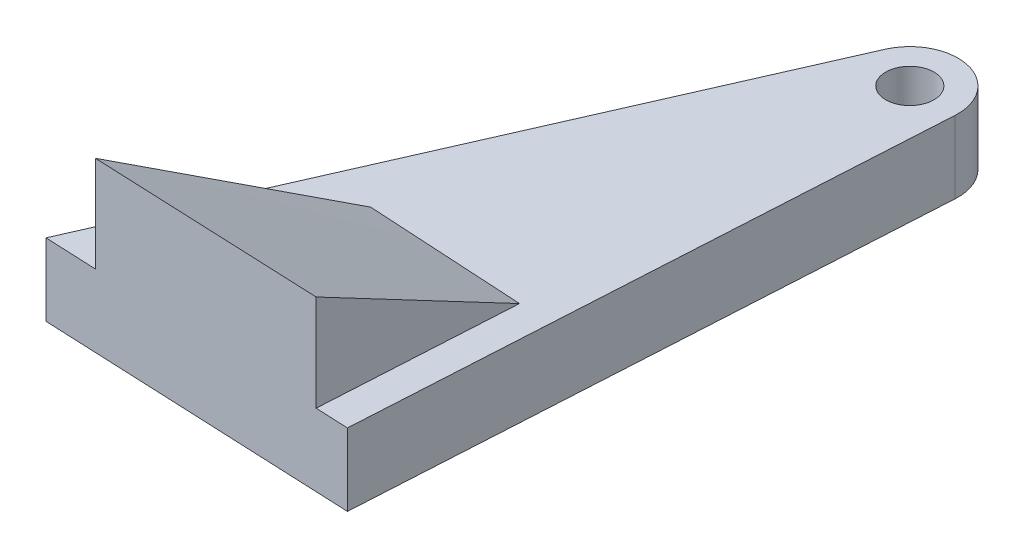
ISO-10303-21;
HEADER;
FILE_DESCRIPTION(('STEP AP214'),'2;1');
FILE_NAME('part.step','',(''),(''),'','','');
FILE_SCHEMA(('AUTOMOTIVE_DESIGN { 1 0 10303 214 1 1 1 1 }'));
ENDSEC;
DATA;
#1=APPLICATION_CONTEXT('core data for automotive mechanical design processes');
#2=APPLICATION_PROTOCOL_DEFINITION('international standard','automotive_design',2000,#1);
#3=PRODUCT_CONTEXT('',#1,'mechanical');
#4=PRODUCT('Part','Part','',(#3));
#5=PRODUCT_RELATED_PRODUCT_CATEGORY('part','',(#4));
#6=PRODUCT_DEFINITION_FORMATION('','',#4);
#7=PRODUCT_DEFINITION_CONTEXT('part definition',#1,'design');
#8=PRODUCT_DEFINITION('design','',#6,#7);
#9=PRODUCT_DEFINITION_SHAPE('','',#8);
#10=(LENGTH_UNIT() NAMED_UNIT(*) SI_UNIT(.MILLI.,.METRE.));
#11=(NAMED_UNIT(*) PLANE_ANGLE_UNIT() SI_UNIT($,.RADIAN.));
#12=(NAMED_UNIT(*) SI_UNIT($,.STERADIAN.) SOLID_ANGLE_UNIT());
#13=UNCERTAINTY_MEASURE_WITH_UNIT(LENGTH_MEASURE(1.E-05),#10,'distance_accuracy_value','');
#14=(GEOMETRIC_REPRESENTATION_CONTEXT(3) GLOBAL_UNCERTAINTY_ASSIGNED_CONTEXT((#13)) GLOBAL_UNIT_ASSIGNED_CONTEXT((#10,
#11,#12)) REPRESENTATION_CONTEXT('',''));
#15=CARTESIAN_POINT('',(0.,0.,0.));
#16=DIRECTION('',(0.,0.,1.));
#17=DIRECTION('',(1.,0.,0.));
#18=AXIS2_PLACEMENT_3D('',#15,#16,#17);
#19=CARTESIAN_POINT('',(0.0971822443924432,0.,-2.20336771731144));
#20=DIRECTION('',(0.0440633917430162,0.,-0.999028737078219));
#21=DIRECTION('',(-0.999028737078219,0.,-0.0440633917430162));
#22=AXIS2_PLACEMENT_3D('',#19,#20,#21);
#23=PLANE('',#22);
#24=DIRECTION('',(0.,1.,0.));
#25=VECTOR('',#24,1.);
#26=CARTESIAN_POINT('',(-155.912359032913,299.750000000374,-9.08436050341978));
#27=LINE('',#26,#25);
#28=CARTESIAN_POINT('',(-155.91235901784,296.750000000374,-9.08436050275499));
#29=VERTEX_POINT('',#28);
#30=CARTESIAN_POINT('',(-155.912359032913,299.750000000374,-9.08436050341978));
#31=VERTEX_POINT('',#30);
#32=EDGE_CURVE('E112',#29,#31,#27,.T.);
#33=ORIENTED_EDGE('',*,*,#32,.T.);
#34=DIRECTION('',(-0.999028737078219,0.,-0.0440633917430162));
#35=VECTOR('',#34,1.);
#36=CARTESIAN_POINT('',(-157.587224197499,299.750000000374,-9.15823249240755));
#37=LINE('',#36,#35);
#38=CARTESIAN_POINT('',(-157.271162701324,299.750000000374,-9.14429221120845));
#39=VERTEX_POINT('',#38);
#40=EDGE_CURVE('E121',#31,#39,#37,.T.);
#41=ORIENTED_EDGE('',*,*,#40,.T.);
#42=DIRECTION('',(0.,-1.,0.));
#43=VECTOR('',#42,1.);
#44=CARTESIAN_POINT('',(-157.271162701324,303.750000000374,-9.14429221120845));
#45=LINE('',#44,#43);
#46=CARTESIAN_POINT('',(-157.271162701324,303.745464129985,-9.14429221120845));
#47=VERTEX_POINT('',#46);
#48=EDGE_CURVE('E165',#47,#39,#45,.T.);
#49=ORIENTED_EDGE('',*,*,#48,.F.);
#50=CARTESIAN_POINT('',(-166.850256823997,303.728007448144,-9.56678994446184));
#51=CARTESIAN_POINT('',(-166.052048846484,303.729441749034,-9.53158399942728));
#52=CARTESIAN_POINT('',(-165.253840877963,303.730881067688,-9.49637805478929));
#53=CARTESIAN_POINT('',(-163.258221174065,303.734492210886,-9.40835879216016));
#54=CARTESIAN_POINT('',(-162.060809450125,303.736670370312,-9.35554547467346));
#55=CARTESIAN_POINT('',(-159.66598604402,303.741049819973,-9.24991884154258));
#56=CARTESIAN_POINT('',(-158.468574361855,303.743251110208,-9.1971055258984));
#57=CARTESIAN_POINT('',(-157.271162701324,303.745464129985,-9.14429221120845));
#58=B_SPLINE_CURVE_WITH_KNOTS('',3,(#50,#51,#52,#53,#54,#55,#56,#57),.UNSPECIFIED.,.F.,.F.,(4,2,
2,4),(0.,2.39695586533243,5.99268937130397,9.58842287860833),.UNSPECIFIED.);
#59=CARTESIAN_POINT('',(-166.850256823997,303.728007448144,-9.56678994446184));
#60=VERTEX_POINT('',#59);
#61=EDGE_CURVE('E155',#60,#47,#58,.T.);
#62=ORIENTED_EDGE('',*,*,#61,.F.);
#63=DIRECTION('',(0.,1.,0.));
#64=VECTOR('',#63,1.);
#65=CARTESIAN_POINT('',(-166.850256823997,303.750000000374,-9.56678994446184));
#66=LINE('',#65,#64);
#67=CARTESIAN_POINT('',(-166.850256823997,299.750000000374,-9.56678994446185));
#68=VERTEX_POINT('',#67);
#69=EDGE_CURVE('E117',#68,#60,#66,.T.);
#70=ORIENTED_EDGE('',*,*,#69,.F.);
#71=CARTESIAN_POINT('',(-168.993386885902,299.750000000374,-9.66131533294081));
#72=VERTEX_POINT('',#71);
#73=EDGE_CURVE('E114',#68,#72,#37,.T.);
#74=ORIENTED_EDGE('',*,*,#73,.T.);
#75=DIRECTION('',(0.,-1.,0.));
#76=VECTOR('',#75,1.);
#77=CARTESIAN_POINT('',(-168.993386885902,299.750000000374,-9.66131533294081));
#78=LINE('',#77,#76);
#79=CARTESIAN_POINT('',(-168.993386885902,296.750000000374,-9.66131533294081));
#80=VERTEX_POINT('',#79);
#81=EDGE_CURVE('E46',#72,#80,#78,.T.);
#82=ORIENTED_EDGE('',*,*,#81,.T.);
#83=DIRECTION('',(-0.999028737078219,0.,-0.0440633917430162));
#84=VECTOR('',#83,1.);
#85=CARTESIAN_POINT('',(-155.527975618642,296.750000000374,-9.06740679995367));
#86=LINE('',#85,#84);
#87=EDGE_CURVE('E161',#29,#80,#86,.T.);
#88=ORIENTED_EDGE('',*,*,#87,.F.);
#89=EDGE_LOOP('',(#33,#41,#49,#62,#70,#74,#82,#88));
#90=FACE_BOUND('',#89,.T.);
#91=ADVANCED_FACE('F42',(#90),#23,.F.);
#92=CARTESIAN_POINT('',(-156.534035996753,299.750000000374,-33.0366775343517));
#93=DIRECTION('',(0.,-1.,0.));
#94=DIRECTION('',(0.,0.,-1.));
#95=AXIS2_PLACEMENT_3D('',#92,#93,#94);
#96=CYLINDRICAL_SURFACE('',#95,0.999999999999998);
#97=CARTESIAN_POINT('',(-156.534035996753,299.750000000374,-33.0366775343517));
#98=DIRECTION('',(0.,-1.,0.));
#99=DIRECTION('',(0.,0.,-1.));
#100=AXIS2_PLACEMENT_3D('',#97,#98,#99);
#101=CIRCLE('',#100,0.999999999999998);
#102=CARTESIAN_POINT('',(-156.534035996753,299.750000000374,-34.0366775343517));
#103=VERTEX_POINT('',#102);
#104=EDGE_CURVE('E142',#103,#103,#101,.T.);
#105=ORIENTED_EDGE('',*,*,#104,.F.);
#106=EDGE_LOOP('',(#105));
#107=FACE_BOUND('',#106,.T.);
#108=CARTESIAN_POINT('',(-156.534035996753,296.750000000374,-33.0366775343517));
#109=DIRECTION('',(0.,-1.,0.));
#110=DIRECTION('',(0.,0.,-1.));
#111=AXIS2_PLACEMENT_3D('',#108,#109,#110);
#112=CIRCLE('',#111,0.999999999999998);
#113=CARTESIAN_POINT('',(-156.534035996753,296.750000000374,-34.0366775343517));
#114=VERTEX_POINT('',#113);
#115=EDGE_CURVE('E153',#114,#114,#112,.T.);
#116=ORIENTED_EDGE('',*,*,#115,.T.);
#117=EDGE_LOOP('',(#116));
#118=FACE_BOUND('',#117,.T.);
#119=ADVANCED_FACE('F207',(#107,#118),#96,.F.);
#120=CARTESIAN_POINT('',(-156.534035996753,299.750000000374,-33.0366775343517));
#121=DIRECTION('',(0.,1.,0.));
#122=DIRECTION('',(0.,0.,1.));
#123=AXIS2_PLACEMENT_3D('',#120,#121,#122);
#124=PLANE('',#123);
#125=ORIENTED_EDGE('',*,*,#40,.F.);
#126=DIRECTION('',(-0.0575875282287934,0.,0.998340461261837));
#127=VECTOR('',#126,1.);
#128=CARTESIAN_POINT('',(-154.537355074229,299.750000000374,-32.9215024778942));
#129=LINE('',#128,#127);
#130=CARTESIAN_POINT('',(-154.537355074229,299.750000000374,-32.9215024778942));
#131=VERTEX_POINT('',#130);
#132=EDGE_CURVE('E130',#131,#31,#129,.T.);
#133=ORIENTED_EDGE('',*,*,#132,.F.);
#134=CARTESIAN_POINT('',(-156.534035996753,299.750000000374,-33.0366775343517));
#135=DIRECTION('',(0.,-1.,0.));
#136=DIRECTION('',(0.,0.,1.));
#137=AXIS2_PLACEMENT_3D('',#134,#135,#136);
#138=CIRCLE('',#137,2.00000000000002);
#139=CARTESIAN_POINT('',(-158.364968743311,299.750000000374,-33.8414664989764));
#140=VERTEX_POINT('',#139);
#141=EDGE_CURVE('E128',#140,#131,#138,.T.);
#142=ORIENTED_EDGE('',*,*,#141,.F.);
#143=DIRECTION('',(0.402394482312312,0.,-0.915466373279));
#144=VECTOR('',#143,1.);
#145=CARTESIAN_POINT('',(-158.364968743311,299.750000000374,-33.8414664989764));
#146=LINE('',#145,#144);
#147=EDGE_CURVE('E108',#72,#140,#146,.T.);
#148=ORIENTED_EDGE('',*,*,#147,.F.);
#149=ORIENTED_EDGE('',*,*,#73,.F.);
#150=DIRECTION('',(-0.402394482312311,0.,0.915466373279001));
#151=VECTOR('',#150,1.);
#152=CARTESIAN_POINT('',(-163.363241115742,299.750000000374,-17.4999146872732));
#153=LINE('',#152,#151);
#154=CARTESIAN_POINT('',(-163.363241115742,299.750000000374,-17.4999146872732));
#155=VERTEX_POINT('',#154);
#156=EDGE_CURVE('E189',#155,#68,#153,.T.);
#157=ORIENTED_EDGE('',*,*,#156,.F.);
#158=DIRECTION('',(-0.998340461261837,0.,-0.0575875282287913));
#159=VECTOR('',#158,1.);
#160=CARTESIAN_POINT('',(-156.810984894622,299.750000000374,-17.1219592154304));
#161=LINE('',#160,#159);
#162=CARTESIAN_POINT('',(-156.810984894622,299.750000000374,-17.1219592154304));
#163=VERTEX_POINT('',#162);
#164=EDGE_CURVE('E58',#163,#155,#161,.T.);
#165=ORIENTED_EDGE('',*,*,#164,.F.);
#166=DIRECTION('',(0.0575875282287919,0.,-0.998340461261837));
#167=VECTOR('',#166,1.);
#168=CARTESIAN_POINT('',(-157.271685120452,299.750000000374,-9.13523552533568));
#169=LINE('',#168,#167);
#170=EDGE_CURVE('E66',#39,#163,#169,.T.);
#171=ORIENTED_EDGE('',*,*,#170,.F.);
#172=EDGE_LOOP('',(#125,#133,#142,#148,#149,#157,#165,#171));
#173=FACE_BOUND('',#172,.T.);
#174=ORIENTED_EDGE('',*,*,#104,.T.);
#175=EDGE_LOOP('',(#174));
#176=FACE_BOUND('',#175,.T.);
#177=ADVANCED_FACE('F124',(#173,#176),#124,.T.);
#178=CARTESIAN_POINT('',(-157.271685120452,303.750000000374,-9.13523552533568));
#179=DIRECTION('',(-0.998340461261837,0.,-0.0575875282287919));
#180=DIRECTION('',(-0.0575875282287919,0.,0.998340461261837));
#181=AXIS2_PLACEMENT_3D('',#178,#179,#180);
#182=PLANE('',#181);
#183=DIRECTION('',(0.0515078511103067,-0.447213595499958,-0.892942854427985));
#184=VECTOR('',#183,1.);
#185=CARTESIAN_POINT('',(-156.810984894622,299.750000000374,-17.1219592154304));
#186=LINE('',#185,#184);
#187=EDGE_CURVE('E51',#47,#163,#186,.T.);
#188=ORIENTED_EDGE('',*,*,#187,.F.);
#189=ORIENTED_EDGE('',*,*,#48,.T.);
#190=ORIENTED_EDGE('',*,*,#170,.T.);
#191=EDGE_LOOP('',(#188,#189,#190));
#192=FACE_BOUND('',#191,.T.);
#193=ADVANCED_FACE('F196',(#192),#182,.F.);
#194=CARTESIAN_POINT('',(-163.363241115742,303.750000000374,-17.4999146872732));
#195=DIRECTION('',(0.915466373279001,0.,0.402394482312311));
#196=DIRECTION('',(0.402394482312311,0.,-0.915466373279001));
#197=AXIS2_PLACEMENT_3D('',#194,#195,#196);
#198=PLANE('',#197);
#199=ORIENTED_EDGE('',*,*,#156,.T.);
#200=ORIENTED_EDGE('',*,*,#69,.T.);
#201=DIRECTION('',(-0.365702790609755,0.417195833466551,0.831991048917227));
#202=VECTOR('',#201,1.);
#203=CARTESIAN_POINT('',(-166.869534911354,303.750000000374,-9.52293138900706));
#204=LINE('',#203,#202);
#205=EDGE_CURVE('E11',#155,#60,#204,.T.);
#206=ORIENTED_EDGE('',*,*,#205,.F.);
#207=EDGE_LOOP('',(#199,#200,#206));
#208=FACE_BOUND('',#207,.T.);
#209=ADVANCED_FACE('F198',(#208),#198,.F.);
#210=CARTESIAN_POINT('',(-166.869534911354,303.750000000374,-9.52293138900706));
#211=CARTESIAN_POINT('',(-157.271685120452,303.750000000374,-9.13523552533568));
#212=CARTESIAN_POINT('',(-166.285152612086,303.083333333707,-10.8524286053847));
#213=CARTESIAN_POINT('',(-157.19490174948,303.083333333707,-10.4663561403515));
#214=CARTESIAN_POINT('',(-165.700770312817,302.41666666704,-12.1819258217623));
#215=CARTESIAN_POINT('',(-157.118118378509,302.41666666704,-11.7974767553672));
#216=CARTESIAN_POINT('',(-164.53200571428,301.083333333707,-14.8409202545177));
#217=CARTESIAN_POINT('',(-156.964551636565,301.083333333707,-14.4597179853988));
#218=CARTESIAN_POINT('',(-163.947623415011,300.41666666704,-16.1704174708955));
#219=CARTESIAN_POINT('',(-156.887768265594,300.41666666704,-15.7908386004146));
#220=CARTESIAN_POINT('',(-163.363241115742,299.750000000374,-17.4999146872732));
#221=CARTESIAN_POINT('',(-156.810984894622,299.750000000374,-17.1219592154304));
#222=B_SPLINE_SURFACE_WITH_KNOTS('',3,1,((#210,#211),(#212,#213),(#214,#215),(#216,#217),(#218,
#219),(#220,#221)),.UNSPECIFIED.,.F.,.F.,.F.,(4,2,4),(2,2),(0.,0.5,1.),(0.,1.),.UNSPECIFIED.);
#223=ORIENTED_EDGE('',*,*,#205,.T.);
#224=ORIENTED_EDGE('',*,*,#61,.T.);
#225=ORIENTED_EDGE('',*,*,#187,.T.);
#226=ORIENTED_EDGE('',*,*,#164,.T.);
#227=EDGE_LOOP('',(#223,#224,#225,#226));
#228=FACE_BOUND('',#227,.T.);
#229=ADVANCED_FACE('F197',(#228),#222,.F.);
#230=CARTESIAN_POINT('',(-156.534035996753,299.750000000374,-33.0366775343517));
#231=DIRECTION('',(0.,-1.,0.));
#232=DIRECTION('',(0.,0.,-1.));
#233=AXIS2_PLACEMENT_3D('',#230,#231,#232);
#234=CYLINDRICAL_SURFACE('',#233,2.00000000000002);
#235=CARTESIAN_POINT('',(-156.534035996753,296.750000000374,-33.0366775343517));
#236=DIRECTION('',(0.,-1.,0.));
#237=DIRECTION('',(0.,0.,1.));
#238=AXIS2_PLACEMENT_3D('',#235,#236,#237);
#239=CIRCLE('',#238,2.00000000000002);
#240=CARTESIAN_POINT('',(-158.364968743311,296.750000000374,-33.8414664989764));
#241=VERTEX_POINT('',#240);
#242=CARTESIAN_POINT('',(-154.537355074229,296.750000000374,-32.9215024778942));
#243=VERTEX_POINT('',#242);
#244=EDGE_CURVE('E138',#241,#243,#239,.T.);
#245=ORIENTED_EDGE('',*,*,#244,.F.);
#246=DIRECTION('',(0.,-1.,0.));
#247=VECTOR('',#246,1.);
#248=CARTESIAN_POINT('',(-158.364968743311,299.750000000374,-33.8414664989764));
#249=LINE('',#248,#247);
#250=EDGE_CURVE('E132',#140,#241,#249,.T.);
#251=ORIENTED_EDGE('',*,*,#250,.F.);
#252=ORIENTED_EDGE('',*,*,#141,.T.);
#253=DIRECTION('',(0.,-1.,0.));
#254=VECTOR('',#253,1.);
#255=CARTESIAN_POINT('',(-154.537355074229,299.750000000374,-32.9215024778942));
#256=LINE('',#255,#254);
#257=EDGE_CURVE('E129',#131,#243,#256,.T.);
#258=ORIENTED_EDGE('',*,*,#257,.T.);
#259=EDGE_LOOP('',(#245,#251,#252,#258));
#260=FACE_BOUND('',#259,.T.);
#261=ADVANCED_FACE('F192',(#260),#234,.T.);
#262=CARTESIAN_POINT('',(-155.797653964247,296.750000000374,-2.95311540362879));
#263=DIRECTION('',(0.,1.,0.));
#264=DIRECTION('',(0.,0.,1.));
#265=AXIS2_PLACEMENT_3D('',#262,#263,#264);
#266=PLANE('',#265);
#267=DIRECTION('',(-0.0575875282287934,0.,0.998340461261837));
#268=VECTOR('',#267,1.);
#269=CARTESIAN_POINT('',(-154.537355074229,296.750000000374,-32.9215024778942));
#270=LINE('',#269,#268);
#271=EDGE_CURVE('E141',#243,#29,#270,.T.);
#272=ORIENTED_EDGE('',*,*,#271,.T.);
#273=ORIENTED_EDGE('',*,*,#87,.T.);
#274=DIRECTION('',(0.402394482312312,0.,-0.915466373279));
#275=VECTOR('',#274,1.);
#276=CARTESIAN_POINT('',(-158.364968743311,296.750000000374,-33.8414664989764));
#277=LINE('',#276,#275);
#278=EDGE_CURVE('E110',#80,#241,#277,.T.);
#279=ORIENTED_EDGE('',*,*,#278,.T.);
#280=ORIENTED_EDGE('',*,*,#244,.T.);
#281=EDGE_LOOP('',(#272,#273,#279,#280));
#282=FACE_BOUND('',#281,.T.);
#283=ORIENTED_EDGE('',*,*,#115,.F.);
#284=EDGE_LOOP('',(#283));
#285=FACE_BOUND('',#284,.T.);
#286=ADVANCED_FACE('F158',(#282,#285),#266,.F.);
#287=CARTESIAN_POINT('',(-154.537355074229,299.750000000374,-32.9215024778942));
#288=DIRECTION('',(0.998340461261837,0.,0.0575875282287934));
#289=DIRECTION('',(0.0575875282287934,0.,-0.998340461261837));
#290=AXIS2_PLACEMENT_3D('',#287,#288,#289);
#291=PLANE('',#290);
#292=ORIENTED_EDGE('',*,*,#32,.F.);
#293=ORIENTED_EDGE('',*,*,#271,.F.);
#294=ORIENTED_EDGE('',*,*,#257,.F.);
#295=ORIENTED_EDGE('',*,*,#132,.T.);
#296=EDGE_LOOP('',(#292,#293,#294,#295));
#297=FACE_BOUND('',#296,.T.);
#298=ADVANCED_FACE('F194',(#297),#291,.T.);
#299=CARTESIAN_POINT('',(-158.364968743311,299.750000000374,-33.8414664989764));
#300=DIRECTION('',(-0.915466373279,0.,-0.402394482312312));
#301=DIRECTION('',(-0.402394482312313,0.,0.915466373279));
#302=AXIS2_PLACEMENT_3D('',#299,#300,#301);
#303=PLANE('',#302);
#304=ORIENTED_EDGE('',*,*,#278,.F.);
#305=ORIENTED_EDGE('',*,*,#81,.F.);
#306=ORIENTED_EDGE('',*,*,#147,.T.);
#307=ORIENTED_EDGE('',*,*,#250,.T.);
#308=EDGE_LOOP('',(#304,#305,#306,#307));
#309=FACE_BOUND('',#308,.T.);
#310=ADVANCED_FACE('F106',(#309),#303,.T.);
#311=CLOSED_SHELL('',(#91,#119,#177,#193,#209,#229,#261,#286,#298,#310));
#312=MANIFOLD_SOLID_BREP('B2',#311);
#313=ADVANCED_BREP_SHAPE_REPRESENTATION('',(#18,#312),#14);
#314=SHAPE_DEFINITION_REPRESENTATION(#9,#313);
ENDSEC;
END-ISO-10303-21;
